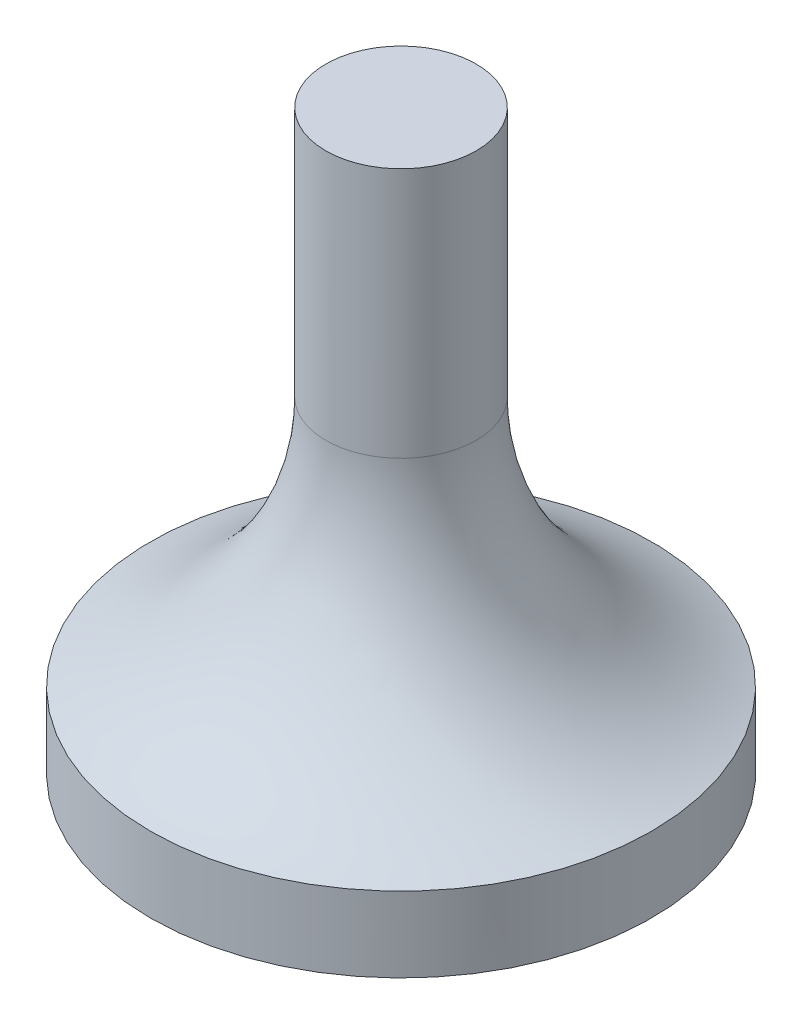
ISO-10303-21;
HEADER;
FILE_DESCRIPTION(('STEP AP214'),'2;1');
FILE_NAME('part.step','',(''),(''),'','','');
FILE_SCHEMA(('AUTOMOTIVE_DESIGN { 1 0 10303 214 1 1 1 1 }'));
ENDSEC;
DATA;
#1=APPLICATION_CONTEXT('core data for automotive mechanical design processes');
#2=APPLICATION_PROTOCOL_DEFINITION('international standard','automotive_design',2000,#1);
#3=PRODUCT_CONTEXT('',#1,'mechanical');
#4=PRODUCT('Part','Part','',(#3));
#5=PRODUCT_RELATED_PRODUCT_CATEGORY('part','',(#4));
#6=PRODUCT_DEFINITION_FORMATION('','',#4);
#7=PRODUCT_DEFINITION_CONTEXT('part definition',#1,'design');
#8=PRODUCT_DEFINITION('design','',#6,#7);
#9=PRODUCT_DEFINITION_SHAPE('','',#8);
#10=(LENGTH_UNIT() NAMED_UNIT(*) SI_UNIT(.MILLI.,.METRE.));
#11=(NAMED_UNIT(*) PLANE_ANGLE_UNIT() SI_UNIT($,.RADIAN.));
#12=(NAMED_UNIT(*) SI_UNIT($,.STERADIAN.) SOLID_ANGLE_UNIT());
#13=UNCERTAINTY_MEASURE_WITH_UNIT(LENGTH_MEASURE(1.E-05),#10,'distance_accuracy_value','');
#14=(GEOMETRIC_REPRESENTATION_CONTEXT(3) GLOBAL_UNCERTAINTY_ASSIGNED_CONTEXT((#13)) GLOBAL_UNIT_ASSIGNED_CONTEXT((#10,
#11,#12)) REPRESENTATION_CONTEXT('',''));
#15=CARTESIAN_POINT('',(0.,0.,0.));
#16=DIRECTION('',(0.,0.,1.));
#17=DIRECTION('',(1.,0.,0.));
#18=AXIS2_PLACEMENT_3D('',#15,#16,#17);
#19=CARTESIAN_POINT('',(0.,3.,0.));
#20=DIRECTION('',(0.,-1.,0.));
#21=DIRECTION('',(0.,0.,-1.));
#22=AXIS2_PLACEMENT_3D('',#19,#20,#21);
#23=CYLINDRICAL_SURFACE('',#22,10.);
#24=CARTESIAN_POINT('',(0.,3.,0.));
#25=DIRECTION('',(0.,1.,0.));
#26=DIRECTION('',(0.,0.,1.));
#27=AXIS2_PLACEMENT_3D('',#24,#25,#26);
#28=CIRCLE('',#27,10.);
#29=CARTESIAN_POINT('',(0.,3.,10.));
#30=VERTEX_POINT('',#29);
#31=EDGE_CURVE('E10',#30,#30,#28,.T.);
#32=ORIENTED_EDGE('',*,*,#31,.F.);
#33=EDGE_LOOP('',(#32));
#34=FACE_BOUND('',#33,.T.);
#35=CARTESIAN_POINT('',(0.,0.,0.));
#36=DIRECTION('',(0.,1.,0.));
#37=DIRECTION('',(0.,0.,1.));
#38=AXIS2_PLACEMENT_3D('',#35,#36,#37);
#39=CIRCLE('',#38,10.);
#40=CARTESIAN_POINT('',(0.,0.,10.));
#41=VERTEX_POINT('',#40);
#42=EDGE_CURVE('E46',#41,#41,#39,.T.);
#43=ORIENTED_EDGE('',*,*,#42,.T.);
#44=EDGE_LOOP('',(#43));
#45=FACE_BOUND('',#44,.T.);
#46=ADVANCED_FACE('F43',(#34,#45),#23,.T.);
#47=CARTESIAN_POINT('',(0.,0.,0.));
#48=DIRECTION('',(0.,1.,0.));
#49=DIRECTION('',(0.,0.,1.));
#50=AXIS2_PLACEMENT_3D('',#47,#48,#49);
#51=PLANE('',#50);
#52=ORIENTED_EDGE('',*,*,#42,.F.);
#53=EDGE_LOOP('',(#52));
#54=FACE_BOUND('',#53,.T.);
#55=ADVANCED_FACE('F80',(#54),#51,.F.);
#56=CARTESIAN_POINT('',(0.,13.,0.));
#57=DIRECTION('',(0.,-1.,0.));
#58=DIRECTION('',(1.,0.,0.));
#59=AXIS2_PLACEMENT_3D('',#56,#57,#58);
#60=TOROIDAL_SURFACE('',#59,13.6428571428571,10.6428571428571);
#61=ORIENTED_EDGE('',*,*,#31,.T.);
#62=EDGE_LOOP('',(#61));
#63=FACE_BOUND('',#62,.T.);
#64=CARTESIAN_POINT('',(0.,12.9999999999999,0.));
#65=DIRECTION('',(0.,-1.,0.));
#66=DIRECTION('',(1.,0.,0.));
#67=AXIS2_PLACEMENT_3D('',#64,#65,#66);
#68=CIRCLE('',#67,2.99999999999996);
#69=CARTESIAN_POINT('',(2.99999999999991,12.9999999999999,0.));
#70=VERTEX_POINT('',#69);
#71=EDGE_CURVE('E60',#70,#70,#68,.T.);
#72=ORIENTED_EDGE('',*,*,#71,.T.);
#73=EDGE_LOOP('',(#72));
#74=FACE_BOUND('',#73,.T.);
#75=ADVANCED_FACE('F65',(#63,#74),#60,.F.);
#76=CARTESIAN_POINT('',(0.,23.,0.));
#77=DIRECTION('',(0.,1.,0.));
#78=DIRECTION('',(0.,0.,1.));
#79=AXIS2_PLACEMENT_3D('',#76,#77,#78);
#80=PLANE('',#79);
#81=CARTESIAN_POINT('',(0.,23.,0.));
#82=DIRECTION('',(0.,1.,0.));
#83=DIRECTION('',(0.,0.,1.));
#84=AXIS2_PLACEMENT_3D('',#81,#82,#83);
#85=CIRCLE('',#84,3.);
#86=CARTESIAN_POINT('',(0.,23.,3.));
#87=VERTEX_POINT('',#86);
#88=EDGE_CURVE('E55',#87,#87,#85,.T.);
#89=ORIENTED_EDGE('',*,*,#88,.T.);
#90=EDGE_LOOP('',(#89));
#91=FACE_BOUND('',#90,.T.);
#92=ADVANCED_FACE('F70',(#91),#80,.T.);
#93=CARTESIAN_POINT('',(0.,23.,0.));
#94=DIRECTION('',(0.,-1.,0.));
#95=DIRECTION('',(0.,0.,-1.));
#96=AXIS2_PLACEMENT_3D('',#93,#94,#95);
#97=CYLINDRICAL_SURFACE('',#96,3.);
#98=ORIENTED_EDGE('',*,*,#71,.F.);
#99=EDGE_LOOP('',(#98));
#100=FACE_BOUND('',#99,.T.);
#101=ORIENTED_EDGE('',*,*,#88,.F.);
#102=EDGE_LOOP('',(#101));
#103=FACE_BOUND('',#102,.T.);
#104=ADVANCED_FACE('F67',(#100,#103),#97,.T.);
#105=CLOSED_SHELL('',(#46,#55,#75,#92,#104));
#106=MANIFOLD_SOLID_BREP('B2',#105);
#107=ADVANCED_BREP_SHAPE_REPRESENTATION('',(#18,#106),#14);
#108=SHAPE_DEFINITION_REPRESENTATION(#9,#107);
ENDSEC;
END-ISO-10303-21;
